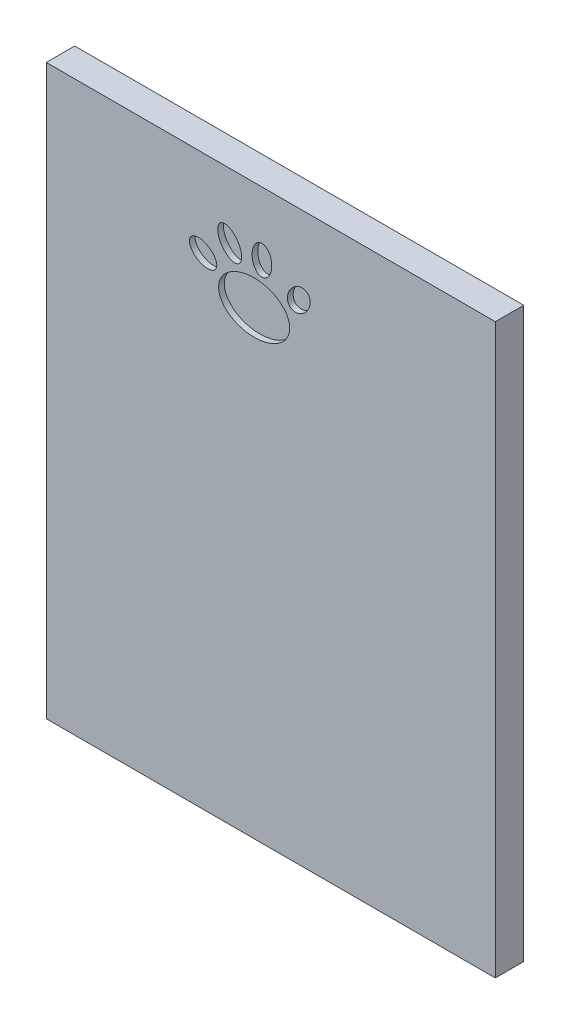
ISO-10303-21;
HEADER;
FILE_DESCRIPTION(('STEP AP214'),'2;1');
FILE_NAME('part.step','',(''),(''),'','','');
FILE_SCHEMA(('AUTOMOTIVE_DESIGN { 1 0 10303 214 1 1 1 1 }'));
ENDSEC;
DATA;
#1=APPLICATION_CONTEXT('core data for automotive mechanical design processes');
#2=APPLICATION_PROTOCOL_DEFINITION('international standard','automotive_design',2000,#1);
#3=PRODUCT_CONTEXT('',#1,'mechanical');
#4=PRODUCT('Part','Part','',(#3));
#5=PRODUCT_RELATED_PRODUCT_CATEGORY('part','',(#4));
#6=PRODUCT_DEFINITION_FORMATION('','',#4);
#7=PRODUCT_DEFINITION_CONTEXT('part definition',#1,'design');
#8=PRODUCT_DEFINITION('design','',#6,#7);
#9=PRODUCT_DEFINITION_SHAPE('','',#8);
#10=(LENGTH_UNIT() NAMED_UNIT(*) SI_UNIT(.MILLI.,.METRE.));
#11=(NAMED_UNIT(*) PLANE_ANGLE_UNIT() SI_UNIT($,.RADIAN.));
#12=(NAMED_UNIT(*) SI_UNIT($,.STERADIAN.) SOLID_ANGLE_UNIT());
#13=UNCERTAINTY_MEASURE_WITH_UNIT(LENGTH_MEASURE(1.E-05),#10,'distance_accuracy_value','');
#14=(GEOMETRIC_REPRESENTATION_CONTEXT(3) GLOBAL_UNCERTAINTY_ASSIGNED_CONTEXT((#13)) GLOBAL_UNIT_ASSIGNED_CONTEXT((#10,
#11,#12)) REPRESENTATION_CONTEXT('',''));
#15=CARTESIAN_POINT('',(0.,0.,0.));
#16=DIRECTION('',(0.,0.,1.));
#17=DIRECTION('',(1.,0.,0.));
#18=AXIS2_PLACEMENT_3D('',#15,#16,#17);
#19=CARTESIAN_POINT('',(0.,0.,10.));
#20=DIRECTION('',(1.,0.,0.));
#21=DIRECTION('',(0.,0.,-1.));
#22=AXIS2_PLACEMENT_3D('',#19,#20,#21);
#23=PLANE('',#22);
#24=DIRECTION('',(0.,-1.,0.));
#25=VECTOR('',#24,1.);
#26=CARTESIAN_POINT('',(0.,0.,0.));
#27=LINE('',#26,#25);
#28=CARTESIAN_POINT('',(0.,200.,0.));
#29=VERTEX_POINT('',#28);
#30=CARTESIAN_POINT('',(0.,0.,0.));
#31=VERTEX_POINT('',#30);
#32=EDGE_CURVE('E96',#29,#31,#27,.T.);
#33=ORIENTED_EDGE('',*,*,#32,.T.);
#34=DIRECTION('',(0.,0.,-1.));
#35=VECTOR('',#34,1.);
#36=CARTESIAN_POINT('',(0.,0.,10.));
#37=LINE('',#36,#35);
#38=CARTESIAN_POINT('',(0.,0.,10.));
#39=VERTEX_POINT('',#38);
#40=EDGE_CURVE('E11',#39,#31,#37,.T.);
#41=ORIENTED_EDGE('',*,*,#40,.F.);
#42=DIRECTION('',(0.,-1.,0.));
#43=VECTOR('',#42,1.);
#44=CARTESIAN_POINT('',(0.,0.,10.));
#45=LINE('',#44,#43);
#46=CARTESIAN_POINT('',(0.,200.,10.));
#47=VERTEX_POINT('',#46);
#48=EDGE_CURVE('E84',#47,#39,#45,.T.);
#49=ORIENTED_EDGE('',*,*,#48,.F.);
#50=DIRECTION('',(0.,0.,-1.));
#51=VECTOR('',#50,1.);
#52=CARTESIAN_POINT('',(0.,200.,10.));
#53=LINE('',#52,#51);
#54=EDGE_CURVE('E92',#47,#29,#53,.T.);
#55=ORIENTED_EDGE('',*,*,#54,.T.);
#56=EDGE_LOOP('',(#33,#41,#49,#55));
#57=FACE_BOUND('',#56,.T.);
#58=ADVANCED_FACE('F33',(#57),#23,.F.);
#59=CARTESIAN_POINT('',(0.,0.,10.));
#60=DIRECTION('',(0.,1.,0.));
#61=DIRECTION('',(0.,0.,1.));
#62=AXIS2_PLACEMENT_3D('',#59,#60,#61);
#63=PLANE('',#62);
#64=DIRECTION('',(1.,0.,0.));
#65=VECTOR('',#64,1.);
#66=CARTESIAN_POINT('',(0.,0.,0.));
#67=LINE('',#66,#65);
#68=CARTESIAN_POINT('',(158.,0.,0.));
#69=VERTEX_POINT('',#68);
#70=EDGE_CURVE('E88',#31,#69,#67,.T.);
#71=ORIENTED_EDGE('',*,*,#70,.T.);
#72=DIRECTION('',(0.,0.,-1.));
#73=VECTOR('',#72,1.);
#74=CARTESIAN_POINT('',(158.,0.,10.));
#75=LINE('',#74,#73);
#76=CARTESIAN_POINT('',(158.,0.,10.));
#77=VERTEX_POINT('',#76);
#78=EDGE_CURVE('E41',#77,#69,#75,.T.);
#79=ORIENTED_EDGE('',*,*,#78,.F.);
#80=DIRECTION('',(1.,0.,0.));
#81=VECTOR('',#80,1.);
#82=CARTESIAN_POINT('',(0.,0.,10.));
#83=LINE('',#82,#81);
#84=EDGE_CURVE('E79',#39,#77,#83,.T.);
#85=ORIENTED_EDGE('',*,*,#84,.F.);
#86=ORIENTED_EDGE('',*,*,#40,.T.);
#87=EDGE_LOOP('',(#71,#79,#85,#86));
#88=FACE_BOUND('',#87,.T.);
#89=ADVANCED_FACE('F87',(#88),#63,.F.);
#90=CARTESIAN_POINT('',(158.,0.,10.));
#91=DIRECTION('',(-1.,0.,0.));
#92=DIRECTION('',(0.,0.,1.));
#93=AXIS2_PLACEMENT_3D('',#90,#91,#92);
#94=PLANE('',#93);
#95=DIRECTION('',(0.,1.,0.));
#96=VECTOR('',#95,1.);
#97=CARTESIAN_POINT('',(158.,0.,0.));
#98=LINE('',#97,#96);
#99=CARTESIAN_POINT('',(158.,200.,0.));
#100=VERTEX_POINT('',#99);
#101=EDGE_CURVE('E66',#69,#100,#98,.T.);
#102=ORIENTED_EDGE('',*,*,#101,.T.);
#103=DIRECTION('',(0.,0.,-1.));
#104=VECTOR('',#103,1.);
#105=CARTESIAN_POINT('',(158.,200.,10.));
#106=LINE('',#105,#104);
#107=CARTESIAN_POINT('',(158.,200.,10.));
#108=VERTEX_POINT('',#107);
#109=EDGE_CURVE('E89',#108,#100,#106,.T.);
#110=ORIENTED_EDGE('',*,*,#109,.F.);
#111=DIRECTION('',(0.,1.,0.));
#112=VECTOR('',#111,1.);
#113=CARTESIAN_POINT('',(158.,0.,10.));
#114=LINE('',#113,#112);
#115=EDGE_CURVE('E82',#77,#108,#114,.T.);
#116=ORIENTED_EDGE('',*,*,#115,.F.);
#117=ORIENTED_EDGE('',*,*,#78,.T.);
#118=EDGE_LOOP('',(#102,#110,#116,#117));
#119=FACE_BOUND('',#118,.T.);
#120=ADVANCED_FACE('F90',(#119),#94,.F.);
#121=CARTESIAN_POINT('',(0.,200.,10.));
#122=DIRECTION('',(0.,-1.,0.));
#123=DIRECTION('',(0.,0.,-1.));
#124=AXIS2_PLACEMENT_3D('',#121,#122,#123);
#125=PLANE('',#124);
#126=DIRECTION('',(-1.,0.,0.));
#127=VECTOR('',#126,1.);
#128=CARTESIAN_POINT('',(0.,200.,0.));
#129=LINE('',#128,#127);
#130=EDGE_CURVE('E72',#100,#29,#129,.T.);
#131=ORIENTED_EDGE('',*,*,#130,.T.);
#132=ORIENTED_EDGE('',*,*,#54,.F.);
#133=DIRECTION('',(-1.,0.,0.));
#134=VECTOR('',#133,1.);
#135=CARTESIAN_POINT('',(0.,200.,10.));
#136=LINE('',#135,#134);
#137=EDGE_CURVE('E49',#108,#47,#136,.T.);
#138=ORIENTED_EDGE('',*,*,#137,.F.);
#139=ORIENTED_EDGE('',*,*,#109,.T.);
#140=EDGE_LOOP('',(#131,#132,#138,#139));
#141=FACE_BOUND('',#140,.T.);
#142=ADVANCED_FACE('F104',(#141),#125,.F.);
#143=CARTESIAN_POINT('',(0.,0.,10.));
#144=DIRECTION('',(0.,0.,-1.));
#145=DIRECTION('',(-1.,0.,0.));
#146=AXIS2_PLACEMENT_3D('',#143,#144,#145);
#147=PLANE('',#146);
#148=CARTESIAN_POINT('',(88.8715159740231,172.008159222074,10.));
#149=DIRECTION('',(0.,0.,1.));
#150=DIRECTION('',(-0.61983453166309,-0.784732536191789,0.));
#151=AXIS2_PLACEMENT_3D('',#148,#149,#150);
#152=ELLIPSE('',#151,4.7488975386185,3.45226577646145);
#153=CARTESIAN_POINT('',(85.9279852922575,168.281544812479,10.));
#154=VERTEX_POINT('',#153);
#155=EDGE_CURVE('E117',#154,#154,#152,.T.);
#156=ORIENTED_EDGE('',*,*,#155,.F.);
#157=EDGE_LOOP('',(#156));
#158=FACE_BOUND('',#157,.T.);
#159=CARTESIAN_POINT('',(75.8801019355695,177.650055904209,10.));
#160=DIRECTION('',(0.,0.,1.));
#161=DIRECTION('',(0.,-1.,0.));
#162=AXIS2_PLACEMENT_3D('',#159,#160,#161);
#163=ELLIPSE('',#162,5.14170542390618,3.45226577646146);
#164=CARTESIAN_POINT('',(75.8801019355695,172.508350480303,10.));
#165=VERTEX_POINT('',#164);
#166=EDGE_CURVE('E271',#165,#165,#163,.T.);
#167=ORIENTED_EDGE('',*,*,#166,.F.);
#168=EDGE_LOOP('',(#167));
#169=FACE_BOUND('',#168,.T.);
#170=CARTESIAN_POINT('',(64.5489956491633,177.167911945765,10.));
#171=DIRECTION('',(0.,0.,1.));
#172=DIRECTION('',(0.541991846108254,-0.840383744935709,0.));
#173=AXIS2_PLACEMENT_3D('',#170,#171,#172);
#174=ELLIPSE('',#173,5.64182761089942,3.45226577646146);
#175=CARTESIAN_POINT('',(67.6068202114192,172.426611729836,10.));
#176=VERTEX_POINT('',#175);
#177=EDGE_CURVE('E277',#176,#176,#174,.T.);
#178=ORIENTED_EDGE('',*,*,#177,.F.);
#179=EDGE_LOOP('',(#178));
#180=FACE_BOUND('',#179,.T.);
#181=CARTESIAN_POINT('',(55.1755506188976,169.508366321254,10.));
#182=DIRECTION('',(0.,0.,1.));
#183=DIRECTION('',(0.868989919462025,-0.494829788789421,0.));
#184=AXIS2_PLACEMENT_3D('',#181,#182,#183);
#185=ELLIPSE('',#184,5.18259063626288,3.45226577646147);
#186=CARTESIAN_POINT('',(59.6791696385084,166.94386609133,10.));
#187=VERTEX_POINT('',#186);
#188=EDGE_CURVE('E284',#187,#187,#185,.T.);
#189=ORIENTED_EDGE('',*,*,#188,.F.);
#190=EDGE_LOOP('',(#189));
#191=FACE_BOUND('',#190,.T.);
#192=CARTESIAN_POINT('',(73.1438268635722,161.889102464521,10.));
#193=DIRECTION('',(0.,0.,1.));
#194=DIRECTION('',(1.,0.,0.));
#195=AXIS2_PLACEMENT_3D('',#192,#193,#194);
#196=ELLIPSE('',#195,12.510915336914,9.0504493926612);
#197=CARTESIAN_POINT('',(85.6547422004862,161.889102464521,10.));
#198=VERTEX_POINT('',#197);
#199=EDGE_CURVE('E110',#198,#198,#196,.T.);
#200=ORIENTED_EDGE('',*,*,#199,.F.);
#201=EDGE_LOOP('',(#200));
#202=FACE_BOUND('',#201,.T.);
#203=ORIENTED_EDGE('',*,*,#48,.T.);
#204=ORIENTED_EDGE('',*,*,#84,.T.);
#205=ORIENTED_EDGE('',*,*,#115,.T.);
#206=ORIENTED_EDGE('',*,*,#137,.T.);
#207=EDGE_LOOP('',(#203,#204,#205,#206));
#208=FACE_BOUND('',#207,.T.);
#209=ADVANCED_FACE('F80',(#158,#169,#180,#191,#202,#208),#147,.F.);
#210=CARTESIAN_POINT('',(0.,0.,0.));
#211=DIRECTION('',(0.,0.,-1.));
#212=DIRECTION('',(-1.,0.,0.));
#213=AXIS2_PLACEMENT_3D('',#210,#211,#212);
#214=PLANE('',#213);
#215=ORIENTED_EDGE('',*,*,#32,.F.);
#216=ORIENTED_EDGE('',*,*,#130,.F.);
#217=ORIENTED_EDGE('',*,*,#101,.F.);
#218=ORIENTED_EDGE('',*,*,#70,.F.);
#219=EDGE_LOOP('',(#215,#216,#217,#218));
#220=FACE_BOUND('',#219,.T.);
#221=ADVANCED_FACE('F107',(#220),#214,.T.);
#222=CARTESIAN_POINT('',(73.1438268635722,161.889102464521,8.));
#223=DIRECTION('',(0.,0.,1.));
#224=DIRECTION('',(1.,0.,0.));
#225=AXIS2_PLACEMENT_3D('',#222,#223,#224);
#226=ELLIPSE('',#225,12.510915336914,9.0504493926612);
#227=DIRECTION('',(0.,0.,1.));
#228=VECTOR('',#227,1.);
#229=SURFACE_OF_LINEAR_EXTRUSION('',#226,#228);
#230=CARTESIAN_POINT('',(85.6547422004862,161.889102464521,8.));
#231=VERTEX_POINT('',#230);
#232=EDGE_CURVE('E99',#231,#231,#226,.T.);
#233=ORIENTED_EDGE('',*,*,#232,.F.);
#234=EDGE_LOOP('',(#233));
#235=FACE_BOUND('',#234,.T.);
#236=ORIENTED_EDGE('',*,*,#199,.T.);
#237=EDGE_LOOP('',(#236));
#238=FACE_BOUND('',#237,.T.);
#239=ADVANCED_FACE('F120',(#235,#238),#229,.F.);
#240=CARTESIAN_POINT('',(73.1438268635722,161.889102464521,8.));
#241=DIRECTION('',(0.,0.,1.));
#242=DIRECTION('',(1.,0.,0.));
#243=AXIS2_PLACEMENT_3D('',#240,#241,#242);
#244=PLANE('',#243);
#245=ORIENTED_EDGE('',*,*,#232,.T.);
#246=EDGE_LOOP('',(#245));
#247=FACE_BOUND('',#246,.T.);
#248=ADVANCED_FACE('F124',(#247),#244,.T.);
#249=CARTESIAN_POINT('',(55.1755506188976,169.508366321254,8.));
#250=DIRECTION('',(0.,0.,1.));
#251=DIRECTION('',(0.868989919462025,-0.494829788789421,0.));
#252=AXIS2_PLACEMENT_3D('',#249,#250,#251);
#253=ELLIPSE('',#252,5.18259063626288,3.45226577646147);
#254=DIRECTION('',(0.,0.,1.));
#255=VECTOR('',#254,1.);
#256=SURFACE_OF_LINEAR_EXTRUSION('',#253,#255);
#257=CARTESIAN_POINT('',(59.6791696385084,166.94386609133,8.));
#258=VERTEX_POINT('',#257);
#259=EDGE_CURVE('E113',#258,#258,#253,.T.);
#260=ORIENTED_EDGE('',*,*,#259,.F.);
#261=EDGE_LOOP('',(#260));
#262=FACE_BOUND('',#261,.T.);
#263=ORIENTED_EDGE('',*,*,#188,.T.);
#264=EDGE_LOOP('',(#263));
#265=FACE_BOUND('',#264,.T.);
#266=ADVANCED_FACE('F184',(#262,#265),#256,.F.);
#267=CARTESIAN_POINT('',(55.1755506188976,169.508366321254,8.));
#268=DIRECTION('',(0.,0.,1.));
#269=DIRECTION('',(1.,0.,0.));
#270=AXIS2_PLACEMENT_3D('',#267,#268,#269);
#271=PLANE('',#270);
#272=ORIENTED_EDGE('',*,*,#259,.T.);
#273=EDGE_LOOP('',(#272));
#274=FACE_BOUND('',#273,.T.);
#275=ADVANCED_FACE('F193',(#274),#271,.T.);
#276=CARTESIAN_POINT('',(64.5489956491633,177.167911945765,8.));
#277=DIRECTION('',(0.,0.,1.));
#278=DIRECTION('',(0.541991846108254,-0.840383744935709,0.));
#279=AXIS2_PLACEMENT_3D('',#276,#277,#278);
#280=ELLIPSE('',#279,5.64182761089942,3.45226577646146);
#281=DIRECTION('',(0.,0.,1.));
#282=VECTOR('',#281,1.);
#283=SURFACE_OF_LINEAR_EXTRUSION('',#280,#282);
#284=CARTESIAN_POINT('',(67.6068202114192,172.426611729836,8.));
#285=VERTEX_POINT('',#284);
#286=EDGE_CURVE('E280',#285,#285,#280,.T.);
#287=ORIENTED_EDGE('',*,*,#286,.F.);
#288=EDGE_LOOP('',(#287));
#289=FACE_BOUND('',#288,.T.);
#290=ORIENTED_EDGE('',*,*,#177,.T.);
#291=EDGE_LOOP('',(#290));
#292=FACE_BOUND('',#291,.T.);
#293=ADVANCED_FACE('F203',(#289,#292),#283,.F.);
#294=CARTESIAN_POINT('',(64.5489956491633,177.167911945765,8.));
#295=DIRECTION('',(0.,0.,1.));
#296=DIRECTION('',(1.,0.,0.));
#297=AXIS2_PLACEMENT_3D('',#294,#295,#296);
#298=PLANE('',#297);
#299=ORIENTED_EDGE('',*,*,#286,.T.);
#300=EDGE_LOOP('',(#299));
#301=FACE_BOUND('',#300,.T.);
#302=ADVANCED_FACE('F213',(#301),#298,.T.);
#303=CARTESIAN_POINT('',(75.8801019355695,177.650055904209,8.));
#304=DIRECTION('',(0.,0.,1.));
#305=DIRECTION('',(0.,-1.,0.));
#306=AXIS2_PLACEMENT_3D('',#303,#304,#305);
#307=ELLIPSE('',#306,5.14170542390618,3.45226577646146);
#308=DIRECTION('',(0.,0.,1.));
#309=VECTOR('',#308,1.);
#310=SURFACE_OF_LINEAR_EXTRUSION('',#307,#309);
#311=CARTESIAN_POINT('',(75.8801019355695,172.508350480303,8.));
#312=VERTEX_POINT('',#311);
#313=EDGE_CURVE('E273',#312,#312,#307,.T.);
#314=ORIENTED_EDGE('',*,*,#313,.F.);
#315=EDGE_LOOP('',(#314));
#316=FACE_BOUND('',#315,.T.);
#317=ORIENTED_EDGE('',*,*,#166,.T.);
#318=EDGE_LOOP('',(#317));
#319=FACE_BOUND('',#318,.T.);
#320=ADVANCED_FACE('F223',(#316,#319),#310,.F.);
#321=CARTESIAN_POINT('',(75.8801019355695,177.650055904209,8.));
#322=DIRECTION('',(0.,0.,1.));
#323=DIRECTION('',(1.,0.,0.));
#324=AXIS2_PLACEMENT_3D('',#321,#322,#323);
#325=PLANE('',#324);
#326=ORIENTED_EDGE('',*,*,#313,.T.);
#327=EDGE_LOOP('',(#326));
#328=FACE_BOUND('',#327,.T.);
#329=ADVANCED_FACE('F233',(#328),#325,.T.);
#330=CARTESIAN_POINT('',(88.8715159740231,172.008159222074,8.));
#331=DIRECTION('',(0.,0.,1.));
#332=DIRECTION('',(-0.61983453166309,-0.784732536191789,0.));
#333=AXIS2_PLACEMENT_3D('',#330,#331,#332);
#334=ELLIPSE('',#333,4.7488975386185,3.45226577646145);
#335=DIRECTION('',(0.,0.,1.));
#336=VECTOR('',#335,1.);
#337=SURFACE_OF_LINEAR_EXTRUSION('',#334,#336);
#338=CARTESIAN_POINT('',(85.9279852922575,168.281544812479,8.));
#339=VERTEX_POINT('',#338);
#340=EDGE_CURVE('E268',#339,#339,#334,.T.);
#341=ORIENTED_EDGE('',*,*,#340,.F.);
#342=EDGE_LOOP('',(#341));
#343=FACE_BOUND('',#342,.T.);
#344=ORIENTED_EDGE('',*,*,#155,.T.);
#345=EDGE_LOOP('',(#344));
#346=FACE_BOUND('',#345,.T.);
#347=ADVANCED_FACE('F243',(#343,#346),#337,.F.);
#348=CARTESIAN_POINT('',(88.8715159740231,172.008159222074,8.));
#349=DIRECTION('',(0.,0.,1.));
#350=DIRECTION('',(1.,0.,0.));
#351=AXIS2_PLACEMENT_3D('',#348,#349,#350);
#352=PLANE('',#351);
#353=ORIENTED_EDGE('',*,*,#340,.T.);
#354=EDGE_LOOP('',(#353));
#355=FACE_BOUND('',#354,.T.);
#356=ADVANCED_FACE('F253',(#355),#352,.T.);
#357=CLOSED_SHELL('',(#58,#89,#120,#142,#209,#221,#239,#248,#266,#275,#293,#302,#320,#329,#347,#356));
#358=MANIFOLD_SOLID_BREP('B2',#357);
#359=ADVANCED_BREP_SHAPE_REPRESENTATION('',(#18,#358),#14);
#360=SHAPE_DEFINITION_REPRESENTATION(#9,#359);
ENDSEC;
END-ISO-10303-21;
